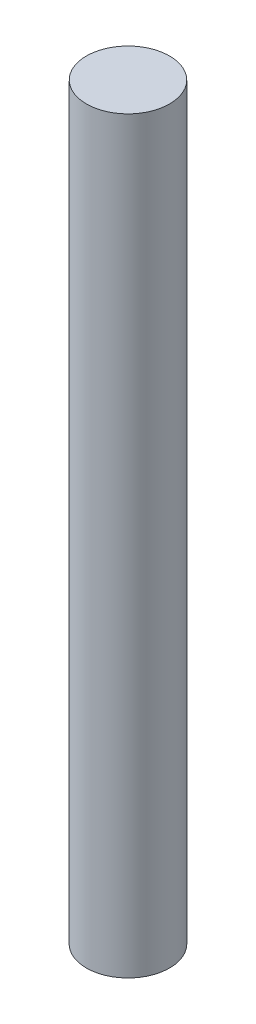
ISO-10303-21;
HEADER;
FILE_DESCRIPTION(('STEP AP214'),'2;1');
FILE_NAME('part.step','',(''),(''),'','','');
FILE_SCHEMA(('AUTOMOTIVE_DESIGN { 1 0 10303 214 1 1 1 1 }'));
ENDSEC;
DATA;
#1=APPLICATION_CONTEXT('core data for automotive mechanical design processes');
#2=APPLICATION_PROTOCOL_DEFINITION('international standard','automotive_design',2000,#1);
#3=PRODUCT_CONTEXT('',#1,'mechanical');
#4=PRODUCT('Part','Part','',(#3));
#5=PRODUCT_RELATED_PRODUCT_CATEGORY('part','',(#4));
#6=PRODUCT_DEFINITION_FORMATION('','',#4);
#7=PRODUCT_DEFINITION_CONTEXT('part definition',#1,'design');
#8=PRODUCT_DEFINITION('design','',#6,#7);
#9=PRODUCT_DEFINITION_SHAPE('','',#8);
#10=(LENGTH_UNIT() NAMED_UNIT(*) SI_UNIT(.MILLI.,.METRE.));
#11=(NAMED_UNIT(*) PLANE_ANGLE_UNIT() SI_UNIT($,.RADIAN.));
#12=(NAMED_UNIT(*) SI_UNIT($,.STERADIAN.) SOLID_ANGLE_UNIT());
#13=UNCERTAINTY_MEASURE_WITH_UNIT(LENGTH_MEASURE(1.E-05),#10,'distance_accuracy_value','');
#14=(GEOMETRIC_REPRESENTATION_CONTEXT(3) GLOBAL_UNCERTAINTY_ASSIGNED_CONTEXT((#13)) GLOBAL_UNIT_ASSIGNED_CONTEXT((#10,
#11,#12)) REPRESENTATION_CONTEXT('',''));
#15=CARTESIAN_POINT('',(0.,0.,0.));
#16=DIRECTION('',(0.,0.,1.));
#17=DIRECTION('',(1.,0.,0.));
#18=AXIS2_PLACEMENT_3D('',#15,#16,#17);
#19=CARTESIAN_POINT('',(0.,36.,0.));
#20=DIRECTION('',(0.,-1.,0.));
#21=DIRECTION('',(0.,0.,-1.));
#22=AXIS2_PLACEMENT_3D('',#19,#20,#21);
#23=CYLINDRICAL_SURFACE('',#22,2.);
#24=CARTESIAN_POINT('',(0.,36.,0.));
#25=DIRECTION('',(0.,1.,0.));
#26=DIRECTION('',(0.,0.,1.));
#27=AXIS2_PLACEMENT_3D('',#24,#25,#26);
#28=CIRCLE('',#27,2.);
#29=CARTESIAN_POINT('',(0.,36.,2.));
#30=VERTEX_POINT('',#29);
#31=EDGE_CURVE('E10',#30,#30,#28,.T.);
#32=ORIENTED_EDGE('',*,*,#31,.F.);
#33=EDGE_LOOP('',(#32));
#34=FACE_BOUND('',#33,.T.);
#35=CARTESIAN_POINT('',(0.,0.,0.));
#36=DIRECTION('',(0.,1.,0.));
#37=DIRECTION('',(0.,0.,1.));
#38=AXIS2_PLACEMENT_3D('',#35,#36,#37);
#39=CIRCLE('',#38,2.);
#40=CARTESIAN_POINT('',(0.,0.,2.));
#41=VERTEX_POINT('',#40);
#42=EDGE_CURVE('E36',#41,#41,#39,.T.);
#43=ORIENTED_EDGE('',*,*,#42,.T.);
#44=EDGE_LOOP('',(#43));
#45=FACE_BOUND('',#44,.T.);
#46=ADVANCED_FACE('F33',(#34,#45),#23,.T.);
#47=CARTESIAN_POINT('',(0.,36.,0.));
#48=DIRECTION('',(0.,1.,0.));
#49=DIRECTION('',(0.,0.,1.));
#50=AXIS2_PLACEMENT_3D('',#47,#48,#49);
#51=PLANE('',#50);
#52=ORIENTED_EDGE('',*,*,#31,.T.);
#53=EDGE_LOOP('',(#52));
#54=FACE_BOUND('',#53,.T.);
#55=ADVANCED_FACE('F48',(#54),#51,.T.);
#56=CARTESIAN_POINT('',(0.,0.,0.));
#57=DIRECTION('',(0.,1.,0.));
#58=DIRECTION('',(0.,0.,1.));
#59=AXIS2_PLACEMENT_3D('',#56,#57,#58);
#60=PLANE('',#59);
#61=ORIENTED_EDGE('',*,*,#42,.F.);
#62=EDGE_LOOP('',(#61));
#63=FACE_BOUND('',#62,.T.);
#64=ADVANCED_FACE('F46',(#63),#60,.F.);
#65=CLOSED_SHELL('',(#46,#55,#64));
#66=MANIFOLD_SOLID_BREP('B2',#65);
#67=ADVANCED_BREP_SHAPE_REPRESENTATION('',(#18,#66),#14);
#68=SHAPE_DEFINITION_REPRESENTATION(#9,#67);
ENDSEC;
END-ISO-10303-21;
